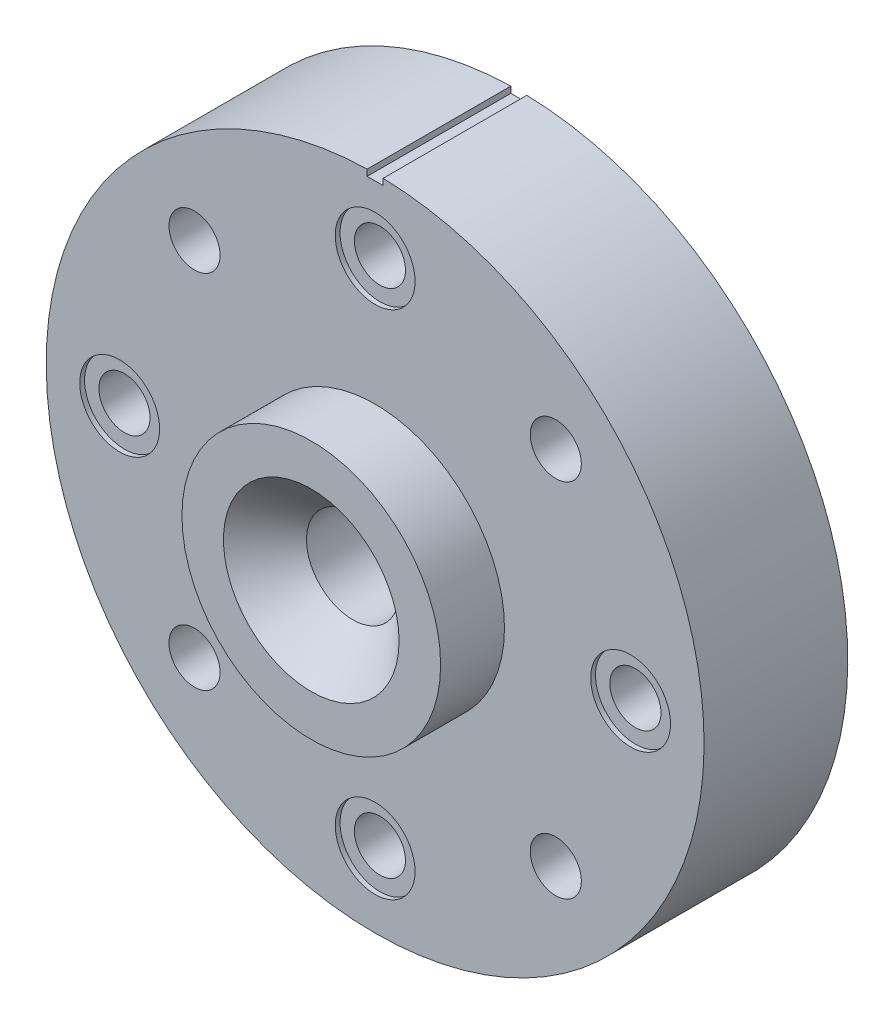
ISO-10303-21;
HEADER;
FILE_DESCRIPTION(('STEP AP214'),'2;1');
FILE_NAME('part.step','',(''),(''),'','','');
FILE_SCHEMA(('AUTOMOTIVE_DESIGN { 1 0 10303 214 1 1 1 1 }'));
ENDSEC;
DATA;
#1=APPLICATION_CONTEXT('core data for automotive mechanical design processes');
#2=APPLICATION_PROTOCOL_DEFINITION('international standard','automotive_design',2000,#1);
#3=PRODUCT_CONTEXT('',#1,'mechanical');
#4=PRODUCT('Part','Part','',(#3));
#5=PRODUCT_RELATED_PRODUCT_CATEGORY('part','',(#4));
#6=PRODUCT_DEFINITION_FORMATION('','',#4);
#7=PRODUCT_DEFINITION_CONTEXT('part definition',#1,'design');
#8=PRODUCT_DEFINITION('design','',#6,#7);
#9=PRODUCT_DEFINITION_SHAPE('','',#8);
#10=(LENGTH_UNIT() NAMED_UNIT(*) SI_UNIT(.MILLI.,.METRE.));
#11=(NAMED_UNIT(*) PLANE_ANGLE_UNIT() SI_UNIT($,.RADIAN.));
#12=(NAMED_UNIT(*) SI_UNIT($,.STERADIAN.) SOLID_ANGLE_UNIT());
#13=UNCERTAINTY_MEASURE_WITH_UNIT(LENGTH_MEASURE(1.E-05),#10,'distance_accuracy_value','');
#14=(GEOMETRIC_REPRESENTATION_CONTEXT(3) GLOBAL_UNCERTAINTY_ASSIGNED_CONTEXT((#13)) GLOBAL_UNIT_ASSIGNED_CONTEXT((#10,
#11,#12)) REPRESENTATION_CONTEXT('',''));
#15=CARTESIAN_POINT('',(0.,0.,0.));
#16=DIRECTION('',(0.,0.,1.));
#17=DIRECTION('',(1.,0.,0.));
#18=AXIS2_PLACEMENT_3D('',#15,#16,#17);
#19=CARTESIAN_POINT('',(0.,-2.99999999999999,1.98068849516631));
#20=DIRECTION('',(0.,0.,1.));
#21=DIRECTION('',(1.,0.,0.));
#22=AXIS2_PLACEMENT_3D('',#19,#20,#21);
#23=CONICAL_SURFACE('',#22,0.800000000026557,1.0297442584592);
#24=CARTESIAN_POINT('',(-5.6843418860808E-11,-2.99999999999999,1.49999999987926));
#25=VERTEX_POINT('',#24);
#26=VERTEX_LOOP('',#25);
#27=FACE_BOUND('',#26,.T.);
#28=CARTESIAN_POINT('',(0.,-2.99999999999999,1.98068849522202));
#29=DIRECTION('',(0.,0.,1.));
#30=DIRECTION('',(1.,0.,0.));
#31=AXIS2_PLACEMENT_3D('',#28,#29,#30);
#32=CIRCLE('',#31,0.799999999999989);
#33=CARTESIAN_POINT('',(0.799999999999989,-2.99999999999999,1.98068849522202));
#34=VERTEX_POINT('',#33);
#35=EDGE_CURVE('E81',#34,#34,#32,.T.);
#36=ORIENTED_EDGE('',*,*,#35,.T.);
#37=EDGE_LOOP('',(#36));
#38=FACE_BOUND('',#37,.T.);
#39=ADVANCED_FACE('F17',(#27,#38),#23,.F.);
#40=CARTESIAN_POINT('',(8.,-11.,1.98068849522315));
#41=DIRECTION('',(0.,0.,1.));
#42=DIRECTION('',(1.,0.,0.));
#43=AXIS2_PLACEMENT_3D('',#40,#41,#42);
#44=CONICAL_SURFACE('',#43,0.800000000007912,1.02974425863714);
#45=CARTESIAN_POINT('',(8.00000000009504,-11.,1.50000000004979));
#46=VERTEX_POINT('',#45);
#47=VERTEX_LOOP('',#46);
#48=FACE_BOUND('',#47,.T.);
#49=CARTESIAN_POINT('',(8.,-11.,1.98068849522202));
#50=DIRECTION('',(0.,0.,1.));
#51=DIRECTION('',(1.,0.,0.));
#52=AXIS2_PLACEMENT_3D('',#49,#50,#51);
#53=CIRCLE('',#52,0.799999999999988);
#54=CARTESIAN_POINT('',(8.79999999999999,-11.,1.98068849522202));
#55=VERTEX_POINT('',#54);
#56=EDGE_CURVE('E83',#55,#55,#53,.T.);
#57=ORIENTED_EDGE('',*,*,#56,.T.);
#58=EDGE_LOOP('',(#57));
#59=FACE_BOUND('',#58,.T.);
#60=ADVANCED_FACE('F78',(#48,#59),#44,.F.);
#61=CARTESIAN_POINT('',(0.,-19.,1.98068849516631));
#62=DIRECTION('',(0.,0.,1.));
#63=DIRECTION('',(1.,0.,0.));
#64=AXIS2_PLACEMENT_3D('',#61,#62,#63);
#65=CONICAL_SURFACE('',#64,0.800000000026557,1.0297442584592);
#66=CARTESIAN_POINT('',(-5.6843418860808E-11,-19.,1.49999999987926));
#67=VERTEX_POINT('',#66);
#68=VERTEX_LOOP('',#67);
#69=FACE_BOUND('',#68,.T.);
#70=CARTESIAN_POINT('',(0.,-19.,1.98068849522202));
#71=DIRECTION('',(0.,0.,1.));
#72=DIRECTION('',(1.,0.,0.));
#73=AXIS2_PLACEMENT_3D('',#70,#71,#72);
#74=CIRCLE('',#73,0.799999999999989);
#75=CARTESIAN_POINT('',(0.799999999999989,-19.,1.98068849522202));
#76=VERTEX_POINT('',#75);
#77=EDGE_CURVE('E86',#76,#76,#74,.T.);
#78=ORIENTED_EDGE('',*,*,#77,.T.);
#79=EDGE_LOOP('',(#78));
#80=FACE_BOUND('',#79,.T.);
#81=ADVANCED_FACE('F513',(#69,#80),#65,.F.);
#82=CARTESIAN_POINT('',(-8.,-11.,1.98068849527999));
#83=DIRECTION('',(0.,0.,1.));
#84=DIRECTION('',(1.,0.,0.));
#85=AXIS2_PLACEMENT_3D('',#82,#83,#84);
#86=CONICAL_SURFACE('',#85,0.800000000045202,1.02974425865772);
#87=CARTESIAN_POINT('',(-7.99999999998136,-11.,1.49999999999295));
#88=VERTEX_POINT('',#87);
#89=VERTEX_LOOP('',#88);
#90=FACE_BOUND('',#89,.T.);
#91=CARTESIAN_POINT('',(-8.,-11.,1.98068849522202));
#92=DIRECTION('',(0.,0.,1.));
#93=DIRECTION('',(1.,0.,0.));
#94=AXIS2_PLACEMENT_3D('',#91,#92,#93);
#95=CIRCLE('',#94,0.799999999999988);
#96=CARTESIAN_POINT('',(-7.20000000000001,-11.,1.98068849522202));
#97=VERTEX_POINT('',#96);
#98=EDGE_CURVE('E166',#97,#97,#95,.T.);
#99=ORIENTED_EDGE('',*,*,#98,.T.);
#100=EDGE_LOOP('',(#99));
#101=FACE_BOUND('',#100,.T.);
#102=ADVANCED_FACE('F504',(#90,#101),#86,.F.);
#103=CARTESIAN_POINT('',(0.,-2.99999999999999,4.5));
#104=DIRECTION('',(0.,0.,1.));
#105=DIRECTION('',(1.,0.,0.));
#106=AXIS2_PLACEMENT_3D('',#103,#104,#105);
#107=CYLINDRICAL_SURFACE('',#106,0.799999999999989);
#108=CARTESIAN_POINT('',(0.,-2.99999999999999,4.35));
#109=DIRECTION('',(0.,0.,1.));
#110=DIRECTION('',(1.,0.,0.));
#111=AXIS2_PLACEMENT_3D('',#108,#109,#110);
#112=CIRCLE('',#111,0.799999999999989);
#113=CARTESIAN_POINT('',(0.799999999999989,-2.99999999999999,4.35));
#114=VERTEX_POINT('',#113);
#115=EDGE_CURVE('E20',#114,#114,#112,.F.);
#116=ORIENTED_EDGE('',*,*,#115,.F.);
#117=EDGE_LOOP('',(#116));
#118=FACE_BOUND('',#117,.T.);
#119=ORIENTED_EDGE('',*,*,#35,.F.);
#120=EDGE_LOOP('',(#119));
#121=FACE_BOUND('',#120,.T.);
#122=ADVANCED_FACE('F495',(#118,#121),#107,.F.);
#123=CARTESIAN_POINT('',(8.,-11.,4.5));
#124=DIRECTION('',(0.,0.,1.));
#125=DIRECTION('',(1.,0.,0.));
#126=AXIS2_PLACEMENT_3D('',#123,#124,#125);
#127=CYLINDRICAL_SURFACE('',#126,0.799999999999988);
#128=CARTESIAN_POINT('',(8.,-11.,4.35));
#129=DIRECTION('',(0.,0.,1.));
#130=DIRECTION('',(1.,0.,0.));
#131=AXIS2_PLACEMENT_3D('',#128,#129,#130);
#132=CIRCLE('',#131,0.799999999999988);
#133=CARTESIAN_POINT('',(8.79999999999999,-11.,4.35));
#134=VERTEX_POINT('',#133);
#135=EDGE_CURVE('E161',#134,#134,#132,.F.);
#136=ORIENTED_EDGE('',*,*,#135,.F.);
#137=EDGE_LOOP('',(#136));
#138=FACE_BOUND('',#137,.T.);
#139=ORIENTED_EDGE('',*,*,#56,.F.);
#140=EDGE_LOOP('',(#139));
#141=FACE_BOUND('',#140,.T.);
#142=ADVANCED_FACE('F486',(#138,#141),#127,.F.);
#143=CARTESIAN_POINT('',(0.,-19.,4.5));
#144=DIRECTION('',(0.,0.,1.));
#145=DIRECTION('',(1.,0.,0.));
#146=AXIS2_PLACEMENT_3D('',#143,#144,#145);
#147=CYLINDRICAL_SURFACE('',#146,0.799999999999989);
#148=CARTESIAN_POINT('',(0.,-19.,4.35));
#149=DIRECTION('',(0.,0.,1.));
#150=DIRECTION('',(1.,0.,0.));
#151=AXIS2_PLACEMENT_3D('',#148,#149,#150);
#152=CIRCLE('',#151,0.799999999999989);
#153=CARTESIAN_POINT('',(0.799999999999989,-19.,4.35));
#154=VERTEX_POINT('',#153);
#155=EDGE_CURVE('E159',#154,#154,#152,.F.);
#156=ORIENTED_EDGE('',*,*,#155,.F.);
#157=EDGE_LOOP('',(#156));
#158=FACE_BOUND('',#157,.T.);
#159=ORIENTED_EDGE('',*,*,#77,.F.);
#160=EDGE_LOOP('',(#159));
#161=FACE_BOUND('',#160,.T.);
#162=ADVANCED_FACE('F477',(#158,#161),#147,.F.);
#163=CARTESIAN_POINT('',(-8.,-11.,4.5));
#164=DIRECTION('',(0.,0.,1.));
#165=DIRECTION('',(1.,0.,0.));
#166=AXIS2_PLACEMENT_3D('',#163,#164,#165);
#167=CYLINDRICAL_SURFACE('',#166,0.799999999999988);
#168=CARTESIAN_POINT('',(-8.,-11.,4.35));
#169=DIRECTION('',(0.,0.,1.));
#170=DIRECTION('',(1.,0.,0.));
#171=AXIS2_PLACEMENT_3D('',#168,#169,#170);
#172=CIRCLE('',#171,0.799999999999988);
#173=CARTESIAN_POINT('',(-7.20000000000001,-11.,4.35));
#174=VERTEX_POINT('',#173);
#175=EDGE_CURVE('E156',#174,#174,#172,.F.);
#176=ORIENTED_EDGE('',*,*,#175,.F.);
#177=EDGE_LOOP('',(#176));
#178=FACE_BOUND('',#177,.T.);
#179=ORIENTED_EDGE('',*,*,#98,.F.);
#180=EDGE_LOOP('',(#179));
#181=FACE_BOUND('',#180,.T.);
#182=ADVANCED_FACE('F468',(#178,#181),#167,.F.);
#183=CARTESIAN_POINT('',(-5.65685424949238,-16.6568542494924,1.5));
#184=DIRECTION('',(0.,0.,1.));
#185=DIRECTION('',(1.,0.,0.));
#186=AXIS2_PLACEMENT_3D('',#183,#184,#185);
#187=PLANE('',#186);
#188=CARTESIAN_POINT('',(-5.65685424949238,-16.6568542494924,1.5));
#189=DIRECTION('',(0.,0.,1.));
#190=DIRECTION('',(1.,0.,0.));
#191=AXIS2_PLACEMENT_3D('',#188,#189,#190);
#192=CIRCLE('',#191,0.800000000000001);
#193=CARTESIAN_POINT('',(-4.85685424949238,-16.6568542494924,1.5));
#194=VERTEX_POINT('',#193);
#195=EDGE_CURVE('E153',#194,#194,#192,.T.);
#196=ORIENTED_EDGE('',*,*,#195,.T.);
#197=EDGE_LOOP('',(#196));
#198=FACE_BOUND('',#197,.T.);
#199=ADVANCED_FACE('F459',(#198),#187,.T.);
#200=CARTESIAN_POINT('',(5.65685424949238,-16.6568542494924,1.5));
#201=DIRECTION('',(0.,0.,1.));
#202=DIRECTION('',(1.,0.,0.));
#203=AXIS2_PLACEMENT_3D('',#200,#201,#202);
#204=PLANE('',#203);
#205=CARTESIAN_POINT('',(5.65685424949238,-16.6568542494924,1.5));
#206=DIRECTION('',(0.,0.,1.));
#207=DIRECTION('',(1.,0.,0.));
#208=AXIS2_PLACEMENT_3D('',#205,#206,#207);
#209=CIRCLE('',#208,0.800000000000002);
#210=CARTESIAN_POINT('',(6.45685424949238,-16.6568542494924,1.5));
#211=VERTEX_POINT('',#210);
#212=EDGE_CURVE('E150',#211,#211,#209,.T.);
#213=ORIENTED_EDGE('',*,*,#212,.T.);
#214=EDGE_LOOP('',(#213));
#215=FACE_BOUND('',#214,.T.);
#216=ADVANCED_FACE('F450',(#215),#204,.T.);
#217=CARTESIAN_POINT('',(5.65685424949238,-5.34314575050762,1.5));
#218=DIRECTION('',(0.,0.,1.));
#219=DIRECTION('',(1.,0.,0.));
#220=AXIS2_PLACEMENT_3D('',#217,#218,#219);
#221=PLANE('',#220);
#222=CARTESIAN_POINT('',(5.65685424949238,-5.34314575050762,1.5));
#223=DIRECTION('',(0.,0.,1.));
#224=DIRECTION('',(1.,0.,0.));
#225=AXIS2_PLACEMENT_3D('',#222,#223,#224);
#226=CIRCLE('',#225,0.800000000000003);
#227=CARTESIAN_POINT('',(6.45685424949238,-5.34314575050762,1.5));
#228=VERTEX_POINT('',#227);
#229=EDGE_CURVE('E147',#228,#228,#226,.T.);
#230=ORIENTED_EDGE('',*,*,#229,.T.);
#231=EDGE_LOOP('',(#230));
#232=FACE_BOUND('',#231,.T.);
#233=ADVANCED_FACE('F441',(#232),#221,.T.);
#234=CARTESIAN_POINT('',(-5.65685424949238,-5.34314575050762,1.5));
#235=DIRECTION('',(0.,0.,1.));
#236=DIRECTION('',(1.,0.,0.));
#237=AXIS2_PLACEMENT_3D('',#234,#235,#236);
#238=PLANE('',#237);
#239=CARTESIAN_POINT('',(-5.65685424949238,-5.34314575050762,1.5));
#240=DIRECTION('',(0.,0.,1.));
#241=DIRECTION('',(1.,0.,0.));
#242=AXIS2_PLACEMENT_3D('',#239,#240,#241);
#243=CIRCLE('',#242,0.800000000000001);
#244=CARTESIAN_POINT('',(-4.85685424949238,-5.34314575050762,1.5));
#245=VERTEX_POINT('',#244);
#246=EDGE_CURVE('E144',#245,#245,#243,.T.);
#247=ORIENTED_EDGE('',*,*,#246,.T.);
#248=EDGE_LOOP('',(#247));
#249=FACE_BOUND('',#248,.T.);
#250=ADVANCED_FACE('F430',(#249),#238,.T.);
#251=CARTESIAN_POINT('',(0.,-2.99999999999999,4.35));
#252=DIRECTION('',(0.,0.,1.));
#253=DIRECTION('',(1.,0.,0.));
#254=AXIS2_PLACEMENT_3D('',#251,#252,#253);
#255=PLANE('',#254);
#256=CARTESIAN_POINT('',(0.,-2.99999999999999,4.35));
#257=DIRECTION('',(0.,0.,1.));
#258=DIRECTION('',(1.,0.,0.));
#259=AXIS2_PLACEMENT_3D('',#256,#257,#258);
#260=CIRCLE('',#259,1.25);
#261=CARTESIAN_POINT('',(1.25,-2.99999999999999,4.35));
#262=VERTEX_POINT('',#261);
#263=EDGE_CURVE('E141',#262,#262,#260,.T.);
#264=ORIENTED_EDGE('',*,*,#263,.T.);
#265=EDGE_LOOP('',(#264));
#266=FACE_BOUND('',#265,.T.);
#267=ORIENTED_EDGE('',*,*,#115,.T.);
#268=EDGE_LOOP('',(#267));
#269=FACE_BOUND('',#268,.T.);
#270=ADVANCED_FACE('F420',(#266,#269),#255,.T.);
#271=CARTESIAN_POINT('',(8.,-11.,4.35));
#272=DIRECTION('',(0.,0.,1.));
#273=DIRECTION('',(1.,0.,0.));
#274=AXIS2_PLACEMENT_3D('',#271,#272,#273);
#275=PLANE('',#274);
#276=CARTESIAN_POINT('',(8.,-11.,4.35));
#277=DIRECTION('',(0.,0.,1.));
#278=DIRECTION('',(1.,0.,0.));
#279=AXIS2_PLACEMENT_3D('',#276,#277,#278);
#280=CIRCLE('',#279,1.25);
#281=CARTESIAN_POINT('',(9.25,-11.,4.35));
#282=VERTEX_POINT('',#281);
#283=EDGE_CURVE('E138',#282,#282,#280,.T.);
#284=ORIENTED_EDGE('',*,*,#283,.T.);
#285=EDGE_LOOP('',(#284));
#286=FACE_BOUND('',#285,.T.);
#287=ORIENTED_EDGE('',*,*,#135,.T.);
#288=EDGE_LOOP('',(#287));
#289=FACE_BOUND('',#288,.T.);
#290=ADVANCED_FACE('F410',(#286,#289),#275,.T.);
#291=CARTESIAN_POINT('',(0.,-19.,4.35));
#292=DIRECTION('',(0.,0.,1.));
#293=DIRECTION('',(1.,0.,0.));
#294=AXIS2_PLACEMENT_3D('',#291,#292,#293);
#295=PLANE('',#294);
#296=CARTESIAN_POINT('',(0.,-19.,4.35));
#297=DIRECTION('',(0.,0.,1.));
#298=DIRECTION('',(1.,0.,0.));
#299=AXIS2_PLACEMENT_3D('',#296,#297,#298);
#300=CIRCLE('',#299,1.25);
#301=CARTESIAN_POINT('',(1.25,-19.,4.35));
#302=VERTEX_POINT('',#301);
#303=EDGE_CURVE('E135',#302,#302,#300,.T.);
#304=ORIENTED_EDGE('',*,*,#303,.T.);
#305=EDGE_LOOP('',(#304));
#306=FACE_BOUND('',#305,.T.);
#307=ORIENTED_EDGE('',*,*,#155,.T.);
#308=EDGE_LOOP('',(#307));
#309=FACE_BOUND('',#308,.T.);
#310=ADVANCED_FACE('F401',(#306,#309),#295,.T.);
#311=CARTESIAN_POINT('',(-8.,-11.,4.35));
#312=DIRECTION('',(0.,0.,1.));
#313=DIRECTION('',(1.,0.,0.));
#314=AXIS2_PLACEMENT_3D('',#311,#312,#313);
#315=PLANE('',#314);
#316=CARTESIAN_POINT('',(-8.,-11.,4.35));
#317=DIRECTION('',(0.,0.,1.));
#318=DIRECTION('',(1.,0.,0.));
#319=AXIS2_PLACEMENT_3D('',#316,#317,#318);
#320=CIRCLE('',#319,1.25);
#321=CARTESIAN_POINT('',(-6.75,-11.,4.35));
#322=VERTEX_POINT('',#321);
#323=EDGE_CURVE('E132',#322,#322,#320,.T.);
#324=ORIENTED_EDGE('',*,*,#323,.T.);
#325=EDGE_LOOP('',(#324));
#326=FACE_BOUND('',#325,.T.);
#327=ORIENTED_EDGE('',*,*,#175,.T.);
#328=EDGE_LOOP('',(#327));
#329=FACE_BOUND('',#328,.T.);
#330=ADVANCED_FACE('F392',(#326,#329),#315,.T.);
#331=CARTESIAN_POINT('',(0.,0.,6.5));
#332=DIRECTION('',(0.,0.,1.));
#333=DIRECTION('',(1.,0.,0.));
#334=AXIS2_PLACEMENT_3D('',#331,#332,#333);
#335=PLANE('',#334);
#336=CARTESIAN_POINT('',(0.,-11.,6.5));
#337=DIRECTION('',(0.,0.,-1.));
#338=DIRECTION('',(-1.,0.,0.));
#339=AXIS2_PLACEMENT_3D('',#336,#337,#338);
#340=CIRCLE('',#339,4.05);
#341=CARTESIAN_POINT('',(-4.05,-11.,6.5));
#342=VERTEX_POINT('',#341);
#343=EDGE_CURVE('E129',#342,#342,#340,.T.);
#344=ORIENTED_EDGE('',*,*,#343,.F.);
#345=EDGE_LOOP('',(#344));
#346=FACE_BOUND('',#345,.T.);
#347=CARTESIAN_POINT('',(0.,-11.,6.50000000001683));
#348=DIRECTION('',(0.,0.,1.));
#349=DIRECTION('',(1.,0.,0.));
#350=AXIS2_PLACEMENT_3D('',#347,#348,#349);
#351=CIRCLE('',#350,2.74999999999181);
#352=CARTESIAN_POINT('',(2.74999999999181,-11.,6.50000000001683));
#353=VERTEX_POINT('',#352);
#354=EDGE_CURVE('E124',#353,#353,#351,.F.);
#355=ORIENTED_EDGE('',*,*,#354,.T.);
#356=EDGE_LOOP('',(#355));
#357=FACE_BOUND('',#356,.T.);
#358=ADVANCED_FACE('F383',(#346,#357),#335,.T.);
#359=CARTESIAN_POINT('',(-5.65685424949238,-16.6568542494924,1.5));
#360=DIRECTION('',(0.,0.,1.));
#361=DIRECTION('',(1.,0.,0.));
#362=AXIS2_PLACEMENT_3D('',#359,#360,#361);
#363=CYLINDRICAL_SURFACE('',#362,0.800000000000001);
#364=CARTESIAN_POINT('',(-5.65685424949238,-16.6568542494924,4.5));
#365=DIRECTION('',(0.,0.,1.));
#366=DIRECTION('',(1.,0.,0.));
#367=AXIS2_PLACEMENT_3D('',#364,#365,#366);
#368=CIRCLE('',#367,0.800000000000001);
#369=CARTESIAN_POINT('',(-4.85685424949238,-16.6568542494924,4.5));
#370=VERTEX_POINT('',#369);
#371=EDGE_CURVE('E120',#370,#370,#368,.F.);
#372=ORIENTED_EDGE('',*,*,#371,.F.);
#373=EDGE_LOOP('',(#372));
#374=FACE_BOUND('',#373,.T.);
#375=ORIENTED_EDGE('',*,*,#195,.F.);
#376=EDGE_LOOP('',(#375));
#377=FACE_BOUND('',#376,.T.);
#378=ADVANCED_FACE('F374',(#374,#377),#363,.F.);
#379=CARTESIAN_POINT('',(5.65685424949238,-16.6568542494924,1.5));
#380=DIRECTION('',(0.,0.,1.));
#381=DIRECTION('',(1.,0.,0.));
#382=AXIS2_PLACEMENT_3D('',#379,#380,#381);
#383=CYLINDRICAL_SURFACE('',#382,0.800000000000002);
#384=CARTESIAN_POINT('',(5.65685424949238,-16.6568542494924,4.5));
#385=DIRECTION('',(0.,0.,1.));
#386=DIRECTION('',(1.,0.,0.));
#387=AXIS2_PLACEMENT_3D('',#384,#385,#386);
#388=CIRCLE('',#387,0.800000000000002);
#389=CARTESIAN_POINT('',(6.45685424949238,-16.6568542494924,4.5));
#390=VERTEX_POINT('',#389);
#391=EDGE_CURVE('E117',#390,#390,#388,.F.);
#392=ORIENTED_EDGE('',*,*,#391,.F.);
#393=EDGE_LOOP('',(#392));
#394=FACE_BOUND('',#393,.T.);
#395=ORIENTED_EDGE('',*,*,#212,.F.);
#396=EDGE_LOOP('',(#395));
#397=FACE_BOUND('',#396,.T.);
#398=ADVANCED_FACE('F365',(#394,#397),#383,.F.);
#399=CARTESIAN_POINT('',(5.65685424949238,-5.34314575050762,1.5));
#400=DIRECTION('',(0.,0.,1.));
#401=DIRECTION('',(1.,0.,0.));
#402=AXIS2_PLACEMENT_3D('',#399,#400,#401);
#403=CYLINDRICAL_SURFACE('',#402,0.800000000000003);
#404=CARTESIAN_POINT('',(5.65685424949238,-5.34314575050762,4.5));
#405=DIRECTION('',(0.,0.,1.));
#406=DIRECTION('',(1.,0.,0.));
#407=AXIS2_PLACEMENT_3D('',#404,#405,#406);
#408=CIRCLE('',#407,0.800000000000003);
#409=CARTESIAN_POINT('',(6.45685424949238,-5.34314575050762,4.5));
#410=VERTEX_POINT('',#409);
#411=EDGE_CURVE('E114',#410,#410,#408,.F.);
#412=ORIENTED_EDGE('',*,*,#411,.F.);
#413=EDGE_LOOP('',(#412));
#414=FACE_BOUND('',#413,.T.);
#415=ORIENTED_EDGE('',*,*,#229,.F.);
#416=EDGE_LOOP('',(#415));
#417=FACE_BOUND('',#416,.T.);
#418=ADVANCED_FACE('F356',(#414,#417),#403,.F.);
#419=CARTESIAN_POINT('',(-5.65685424949238,-5.34314575050762,1.5));
#420=DIRECTION('',(0.,0.,1.));
#421=DIRECTION('',(1.,0.,0.));
#422=AXIS2_PLACEMENT_3D('',#419,#420,#421);
#423=CYLINDRICAL_SURFACE('',#422,0.800000000000001);
#424=CARTESIAN_POINT('',(-5.65685424949238,-5.34314575050762,4.5));
#425=DIRECTION('',(0.,0.,1.));
#426=DIRECTION('',(1.,0.,0.));
#427=AXIS2_PLACEMENT_3D('',#424,#425,#426);
#428=CIRCLE('',#427,0.800000000000001);
#429=CARTESIAN_POINT('',(-4.85685424949238,-5.34314575050762,4.5));
#430=VERTEX_POINT('',#429);
#431=EDGE_CURVE('E111',#430,#430,#428,.F.);
#432=ORIENTED_EDGE('',*,*,#431,.F.);
#433=EDGE_LOOP('',(#432));
#434=FACE_BOUND('',#433,.T.);
#435=ORIENTED_EDGE('',*,*,#246,.F.);
#436=EDGE_LOOP('',(#435));
#437=FACE_BOUND('',#436,.T.);
#438=ADVANCED_FACE('F345',(#434,#437),#423,.F.);
#439=CARTESIAN_POINT('',(0.,-2.99999999999999,4.35));
#440=DIRECTION('',(0.,0.,1.));
#441=DIRECTION('',(1.,0.,0.));
#442=AXIS2_PLACEMENT_3D('',#439,#440,#441);
#443=CYLINDRICAL_SURFACE('',#442,1.25);
#444=CARTESIAN_POINT('',(0.,-2.99999999999999,4.5));
#445=DIRECTION('',(0.,0.,1.));
#446=DIRECTION('',(1.,0.,0.));
#447=AXIS2_PLACEMENT_3D('',#444,#445,#446);
#448=CIRCLE('',#447,1.25);
#449=CARTESIAN_POINT('',(1.25,-2.99999999999999,4.5));
#450=VERTEX_POINT('',#449);
#451=EDGE_CURVE('E108',#450,#450,#448,.F.);
#452=ORIENTED_EDGE('',*,*,#451,.F.);
#453=EDGE_LOOP('',(#452));
#454=FACE_BOUND('',#453,.T.);
#455=ORIENTED_EDGE('',*,*,#263,.F.);
#456=EDGE_LOOP('',(#455));
#457=FACE_BOUND('',#456,.T.);
#458=ADVANCED_FACE('F335',(#454,#457),#443,.F.);
#459=CARTESIAN_POINT('',(8.,-11.,4.35));
#460=DIRECTION('',(0.,0.,1.));
#461=DIRECTION('',(1.,0.,0.));
#462=AXIS2_PLACEMENT_3D('',#459,#460,#461);
#463=CYLINDRICAL_SURFACE('',#462,1.25);
#464=CARTESIAN_POINT('',(8.,-11.,4.5));
#465=DIRECTION('',(0.,0.,1.));
#466=DIRECTION('',(1.,0.,0.));
#467=AXIS2_PLACEMENT_3D('',#464,#465,#466);
#468=CIRCLE('',#467,1.25);
#469=CARTESIAN_POINT('',(9.25,-11.,4.5));
#470=VERTEX_POINT('',#469);
#471=EDGE_CURVE('E105',#470,#470,#468,.F.);
#472=ORIENTED_EDGE('',*,*,#471,.F.);
#473=EDGE_LOOP('',(#472));
#474=FACE_BOUND('',#473,.T.);
#475=ORIENTED_EDGE('',*,*,#283,.F.);
#476=EDGE_LOOP('',(#475));
#477=FACE_BOUND('',#476,.T.);
#478=ADVANCED_FACE('F325',(#474,#477),#463,.F.);
#479=CARTESIAN_POINT('',(0.,-19.,4.35));
#480=DIRECTION('',(0.,0.,1.));
#481=DIRECTION('',(1.,0.,0.));
#482=AXIS2_PLACEMENT_3D('',#479,#480,#481);
#483=CYLINDRICAL_SURFACE('',#482,1.25);
#484=CARTESIAN_POINT('',(0.,-19.,4.5));
#485=DIRECTION('',(0.,0.,1.));
#486=DIRECTION('',(1.,0.,0.));
#487=AXIS2_PLACEMENT_3D('',#484,#485,#486);
#488=CIRCLE('',#487,1.25);
#489=CARTESIAN_POINT('',(1.25,-19.,4.5));
#490=VERTEX_POINT('',#489);
#491=EDGE_CURVE('E102',#490,#490,#488,.F.);
#492=ORIENTED_EDGE('',*,*,#491,.F.);
#493=EDGE_LOOP('',(#492));
#494=FACE_BOUND('',#493,.T.);
#495=ORIENTED_EDGE('',*,*,#303,.F.);
#496=EDGE_LOOP('',(#495));
#497=FACE_BOUND('',#496,.T.);
#498=ADVANCED_FACE('F315',(#494,#497),#483,.F.);
#499=CARTESIAN_POINT('',(-8.,-11.,4.35));
#500=DIRECTION('',(0.,0.,1.));
#501=DIRECTION('',(1.,0.,0.));
#502=AXIS2_PLACEMENT_3D('',#499,#500,#501);
#503=CYLINDRICAL_SURFACE('',#502,1.25);
#504=CARTESIAN_POINT('',(-8.,-11.,4.5));
#505=DIRECTION('',(0.,0.,1.));
#506=DIRECTION('',(1.,0.,0.));
#507=AXIS2_PLACEMENT_3D('',#504,#505,#506);
#508=CIRCLE('',#507,1.25);
#509=CARTESIAN_POINT('',(-6.75,-11.,4.5));
#510=VERTEX_POINT('',#509);
#511=EDGE_CURVE('E99',#510,#510,#508,.F.);
#512=ORIENTED_EDGE('',*,*,#511,.F.);
#513=EDGE_LOOP('',(#512));
#514=FACE_BOUND('',#513,.T.);
#515=ORIENTED_EDGE('',*,*,#323,.F.);
#516=EDGE_LOOP('',(#515));
#517=FACE_BOUND('',#516,.T.);
#518=ADVANCED_FACE('F232',(#514,#517),#503,.F.);
#519=CARTESIAN_POINT('',(0.,-11.,22.2551298552221));
#520=DIRECTION('',(0.,0.,-1.));
#521=DIRECTION('',(-1.,0.,0.));
#522=AXIS2_PLACEMENT_3D('',#519,#520,#521);
#523=CYLINDRICAL_SURFACE('',#522,4.05);
#524=CARTESIAN_POINT('',(0.,-11.,4.5));
#525=DIRECTION('',(0.,0.,-1.));
#526=DIRECTION('',(-1.,0.,0.));
#527=AXIS2_PLACEMENT_3D('',#524,#525,#526);
#528=CIRCLE('',#527,4.05);
#529=CARTESIAN_POINT('',(-4.05,-11.,4.5));
#530=VERTEX_POINT('',#529);
#531=EDGE_CURVE('E95',#530,#530,#528,.T.);
#532=ORIENTED_EDGE('',*,*,#531,.F.);
#533=EDGE_LOOP('',(#532));
#534=FACE_BOUND('',#533,.T.);
#535=ORIENTED_EDGE('',*,*,#343,.T.);
#536=EDGE_LOOP('',(#535));
#537=FACE_BOUND('',#536,.T.);
#538=ADVANCED_FACE('F223',(#534,#537),#523,.T.);
#539=CARTESIAN_POINT('',(-0.249999999999999,-0.899999999999992,0.));
#540=DIRECTION('',(0.,-1.,0.));
#541=DIRECTION('',(1.,0.,0.));
#542=AXIS2_PLACEMENT_3D('',#539,#540,#541);
#543=PLANE('',#542);
#544=DIRECTION('',(0.,0.,-1.));
#545=VECTOR('',#544,1.);
#546=CARTESIAN_POINT('',(0.249999999999999,-0.899999999999992,0.));
#547=LINE('',#546,#545);
#548=CARTESIAN_POINT('',(0.249999999999999,-0.899999999999992,4.5));
#549=VERTEX_POINT('',#548);
#550=CARTESIAN_POINT('',(0.249999999999999,-0.899999999999992,0.));
#551=VERTEX_POINT('',#550);
#552=EDGE_CURVE('E127',#549,#551,#547,.T.);
#553=ORIENTED_EDGE('',*,*,#552,.T.);
#554=DIRECTION('',(1.,0.,0.));
#555=VECTOR('',#554,1.);
#556=CARTESIAN_POINT('',(-0.249999999999999,-0.899999999999992,0.));
#557=LINE('',#556,#555);
#558=CARTESIAN_POINT('',(-0.249999999999999,-0.899999999999992,0.));
#559=VERTEX_POINT('',#558);
#560=EDGE_CURVE('E128',#559,#551,#557,.T.);
#561=ORIENTED_EDGE('',*,*,#560,.F.);
#562=DIRECTION('',(0.,0.,1.));
#563=VECTOR('',#562,1.);
#564=CARTESIAN_POINT('',(-0.249999999999999,-0.899999999999992,0.));
#565=LINE('',#564,#563);
#566=CARTESIAN_POINT('',(-0.249999999999999,-0.899999999999992,4.5));
#567=VERTEX_POINT('',#566);
#568=EDGE_CURVE('E184',#559,#567,#565,.T.);
#569=ORIENTED_EDGE('',*,*,#568,.T.);
#570=DIRECTION('',(1.,0.,0.));
#571=VECTOR('',#570,1.);
#572=CARTESIAN_POINT('',(0.,-0.899999999999992,4.5));
#573=LINE('',#572,#571);
#574=EDGE_CURVE('E55',#549,#567,#573,.F.);
#575=ORIENTED_EDGE('',*,*,#574,.F.);
#576=EDGE_LOOP('',(#553,#561,#569,#575));
#577=FACE_BOUND('',#576,.T.);
#578=ADVANCED_FACE('F220',(#577),#543,.F.);
#579=CARTESIAN_POINT('',(0.,-11.,6.49999999990314));
#580=DIRECTION('',(0.,0.,1.));
#581=DIRECTION('',(1.,0.,0.));
#582=AXIS2_PLACEMENT_3D('',#579,#580,#581);
#583=CONICAL_SURFACE('',#582,2.74999999987813,0.785398163397448);
#584=CARTESIAN_POINT('',(0.,-11.,5.19999999999999));
#585=DIRECTION('',(0.,0.,1.));
#586=DIRECTION('',(1.,0.,0.));
#587=AXIS2_PLACEMENT_3D('',#584,#585,#586);
#588=CIRCLE('',#587,1.44999999999999);
#589=CARTESIAN_POINT('',(1.44999999999999,-11.,5.19999999999999));
#590=VERTEX_POINT('',#589);
#591=EDGE_CURVE('E192',#590,#590,#588,.F.);
#592=ORIENTED_EDGE('',*,*,#591,.T.);
#593=EDGE_LOOP('',(#592));
#594=FACE_BOUND('',#593,.T.);
#595=ORIENTED_EDGE('',*,*,#354,.F.);
#596=EDGE_LOOP('',(#595));
#597=FACE_BOUND('',#596,.T.);
#598=ADVANCED_FACE('F222',(#594,#597),#583,.F.);
#599=CARTESIAN_POINT('',(0.249999999999999,0.,0.));
#600=DIRECTION('',(1.,0.,0.));
#601=DIRECTION('',(0.,0.,-1.));
#602=AXIS2_PLACEMENT_3D('',#599,#600,#601);
#603=PLANE('',#602);
#604=ORIENTED_EDGE('',*,*,#552,.F.);
#605=DIRECTION('',(0.,1.,0.));
#606=VECTOR('',#605,1.);
#607=CARTESIAN_POINT('',(0.249999999999999,0.,4.5));
#608=LINE('',#607,#606);
#609=CARTESIAN_POINT('',(0.249999999999999,-0.703034427560702,4.5));
#610=VERTEX_POINT('',#609);
#611=EDGE_CURVE('E98',#610,#549,#608,.F.);
#612=ORIENTED_EDGE('',*,*,#611,.F.);
#613=DIRECTION('',(0.,0.,-1.));
#614=VECTOR('',#613,1.);
#615=CARTESIAN_POINT('',(0.25,-0.703034427560702,35.9327993848858));
#616=LINE('',#615,#614);
#617=CARTESIAN_POINT('',(0.249999999999999,-0.703034427560702,0.));
#618=VERTEX_POINT('',#617);
#619=EDGE_CURVE('E94',#618,#610,#616,.F.);
#620=ORIENTED_EDGE('',*,*,#619,.F.);
#621=DIRECTION('',(0.,1.,0.));
#622=VECTOR('',#621,1.);
#623=CARTESIAN_POINT('',(0.249999999999999,0.,0.));
#624=LINE('',#623,#622);
#625=EDGE_CURVE('E123',#551,#618,#624,.T.);
#626=ORIENTED_EDGE('',*,*,#625,.F.);
#627=EDGE_LOOP('',(#604,#612,#620,#626));
#628=FACE_BOUND('',#627,.T.);
#629=ADVANCED_FACE('F219',(#628),#603,.F.);
#630=CARTESIAN_POINT('',(0.,0.,4.5));
#631=DIRECTION('',(0.,0.,1.));
#632=DIRECTION('',(1.,0.,0.));
#633=AXIS2_PLACEMENT_3D('',#630,#631,#632);
#634=PLANE('',#633);
#635=ORIENTED_EDGE('',*,*,#611,.T.);
#636=ORIENTED_EDGE('',*,*,#574,.T.);
#637=DIRECTION('',(0.,1.,0.));
#638=VECTOR('',#637,1.);
#639=CARTESIAN_POINT('',(-0.249999999999999,0.,4.5));
#640=LINE('',#639,#638);
#641=CARTESIAN_POINT('',(-0.249999999999999,-0.703034427560702,4.5));
#642=VERTEX_POINT('',#641);
#643=EDGE_CURVE('E187',#567,#642,#640,.T.);
#644=ORIENTED_EDGE('',*,*,#643,.T.);
#645=CARTESIAN_POINT('',(0.,-11.,4.5));
#646=DIRECTION('',(0.,0.,-1.));
#647=DIRECTION('',(-1.,0.,0.));
#648=AXIS2_PLACEMENT_3D('',#645,#646,#647);
#649=CIRCLE('',#648,10.3);
#650=EDGE_CURVE('E45',#610,#642,#649,.T.);
#651=ORIENTED_EDGE('',*,*,#650,.F.);
#652=EDGE_LOOP('',(#635,#636,#644,#651));
#653=FACE_BOUND('',#652,.T.);
#654=ORIENTED_EDGE('',*,*,#531,.T.);
#655=EDGE_LOOP('',(#654));
#656=FACE_BOUND('',#655,.T.);
#657=ORIENTED_EDGE('',*,*,#511,.T.);
#658=EDGE_LOOP('',(#657));
#659=FACE_BOUND('',#658,.T.);
#660=ORIENTED_EDGE('',*,*,#491,.T.);
#661=EDGE_LOOP('',(#660));
#662=FACE_BOUND('',#661,.T.);
#663=ORIENTED_EDGE('',*,*,#471,.T.);
#664=EDGE_LOOP('',(#663));
#665=FACE_BOUND('',#664,.T.);
#666=ORIENTED_EDGE('',*,*,#451,.T.);
#667=EDGE_LOOP('',(#666));
#668=FACE_BOUND('',#667,.T.);
#669=ORIENTED_EDGE('',*,*,#431,.T.);
#670=EDGE_LOOP('',(#669));
#671=FACE_BOUND('',#670,.T.);
#672=ORIENTED_EDGE('',*,*,#411,.T.);
#673=EDGE_LOOP('',(#672));
#674=FACE_BOUND('',#673,.T.);
#675=ORIENTED_EDGE('',*,*,#391,.T.);
#676=EDGE_LOOP('',(#675));
#677=FACE_BOUND('',#676,.T.);
#678=ORIENTED_EDGE('',*,*,#371,.T.);
#679=EDGE_LOOP('',(#678));
#680=FACE_BOUND('',#679,.T.);
#681=ADVANCED_FACE('F248',(#653,#656,#659,#662,#665,#668,#671,#674,#677,#680),#634,.T.);
#682=CARTESIAN_POINT('',(-0.249999999999999,0.,0.));
#683=DIRECTION('',(-1.,0.,0.));
#684=DIRECTION('',(0.,0.,1.));
#685=AXIS2_PLACEMENT_3D('',#682,#683,#684);
#686=PLANE('',#685);
#687=ORIENTED_EDGE('',*,*,#568,.F.);
#688=DIRECTION('',(0.,1.,0.));
#689=VECTOR('',#688,1.);
#690=CARTESIAN_POINT('',(-0.249999999999999,0.,0.));
#691=LINE('',#690,#689);
#692=CARTESIAN_POINT('',(-0.249999999999999,-0.703034427560702,0.));
#693=VERTEX_POINT('',#692);
#694=EDGE_CURVE('E188',#693,#559,#691,.F.);
#695=ORIENTED_EDGE('',*,*,#694,.F.);
#696=DIRECTION('',(0.,0.,-1.));
#697=VECTOR('',#696,1.);
#698=CARTESIAN_POINT('',(-0.249999999999999,-0.703034427560702,35.9327993848858));
#699=LINE('',#698,#697);
#700=EDGE_CURVE('E92',#642,#693,#699,.T.);
#701=ORIENTED_EDGE('',*,*,#700,.F.);
#702=ORIENTED_EDGE('',*,*,#643,.F.);
#703=EDGE_LOOP('',(#687,#695,#701,#702));
#704=FACE_BOUND('',#703,.T.);
#705=ADVANCED_FACE('F212',(#704),#686,.F.);
#706=CARTESIAN_POINT('',(0.,-11.,6.5));
#707=DIRECTION('',(0.,0.,1.));
#708=DIRECTION('',(1.,0.,0.));
#709=AXIS2_PLACEMENT_3D('',#706,#707,#708);
#710=CYLINDRICAL_SURFACE('',#709,1.44999999999999);
#711=CARTESIAN_POINT('',(0.,-11.,0.));
#712=DIRECTION('',(0.,0.,1.));
#713=DIRECTION('',(1.,0.,0.));
#714=AXIS2_PLACEMENT_3D('',#711,#712,#713);
#715=CIRCLE('',#714,1.44999999999999);
#716=CARTESIAN_POINT('',(1.44999999999999,-11.,0.));
#717=VERTEX_POINT('',#716);
#718=EDGE_CURVE('E26',#717,#717,#715,.F.);
#719=ORIENTED_EDGE('',*,*,#718,.T.);
#720=EDGE_LOOP('',(#719));
#721=FACE_BOUND('',#720,.T.);
#722=ORIENTED_EDGE('',*,*,#591,.F.);
#723=EDGE_LOOP('',(#722));
#724=FACE_BOUND('',#723,.T.);
#725=ADVANCED_FACE('F240',(#721,#724),#710,.F.);
#726=CARTESIAN_POINT('',(0.,-11.,35.9327993848858));
#727=DIRECTION('',(0.,0.,-1.));
#728=DIRECTION('',(-1.,0.,0.));
#729=AXIS2_PLACEMENT_3D('',#726,#727,#728);
#730=CYLINDRICAL_SURFACE('',#729,10.3);
#731=ORIENTED_EDGE('',*,*,#700,.T.);
#732=CARTESIAN_POINT('',(0.,-11.,0.));
#733=DIRECTION('',(0.,0.,-1.));
#734=DIRECTION('',(-1.,0.,0.));
#735=AXIS2_PLACEMENT_3D('',#732,#733,#734);
#736=CIRCLE('',#735,10.3);
#737=EDGE_CURVE('E11',#693,#618,#736,.F.);
#738=ORIENTED_EDGE('',*,*,#737,.T.);
#739=ORIENTED_EDGE('',*,*,#619,.T.);
#740=ORIENTED_EDGE('',*,*,#650,.T.);
#741=EDGE_LOOP('',(#731,#738,#739,#740));
#742=FACE_BOUND('',#741,.T.);
#743=ADVANCED_FACE('F209',(#742),#730,.T.);
#744=CARTESIAN_POINT('',(0.,-11.,0.));
#745=DIRECTION('',(0.,0.,1.));
#746=DIRECTION('',(1.,0.,0.));
#747=AXIS2_PLACEMENT_3D('',#744,#745,#746);
#748=PLANE('',#747);
#749=ORIENTED_EDGE('',*,*,#694,.T.);
#750=ORIENTED_EDGE('',*,*,#560,.T.);
#751=ORIENTED_EDGE('',*,*,#625,.T.);
#752=ORIENTED_EDGE('',*,*,#737,.F.);
#753=EDGE_LOOP('',(#749,#750,#751,#752));
#754=FACE_BOUND('',#753,.T.);
#755=ORIENTED_EDGE('',*,*,#718,.F.);
#756=EDGE_LOOP('',(#755));
#757=FACE_BOUND('',#756,.T.);
#758=ADVANCED_FACE('F213',(#754,#757),#748,.F.);
#759=CLOSED_SHELL('',(#39,#60,#81,#102,#122,#142,#162,#182,#199,#216,#233,#250,#270,#290,#310,
#330,#358,#378,#398,#418,#438,#458,#478,#498,#518,#538,#578,#598,#629,#681,#705,#725,#743,#758));
#760=MANIFOLD_SOLID_BREP('B1',#759);
#761=ADVANCED_BREP_SHAPE_REPRESENTATION('',(#18,#760),#14);
#762=SHAPE_DEFINITION_REPRESENTATION(#9,#761);
ENDSEC;
END-ISO-10303-21;
